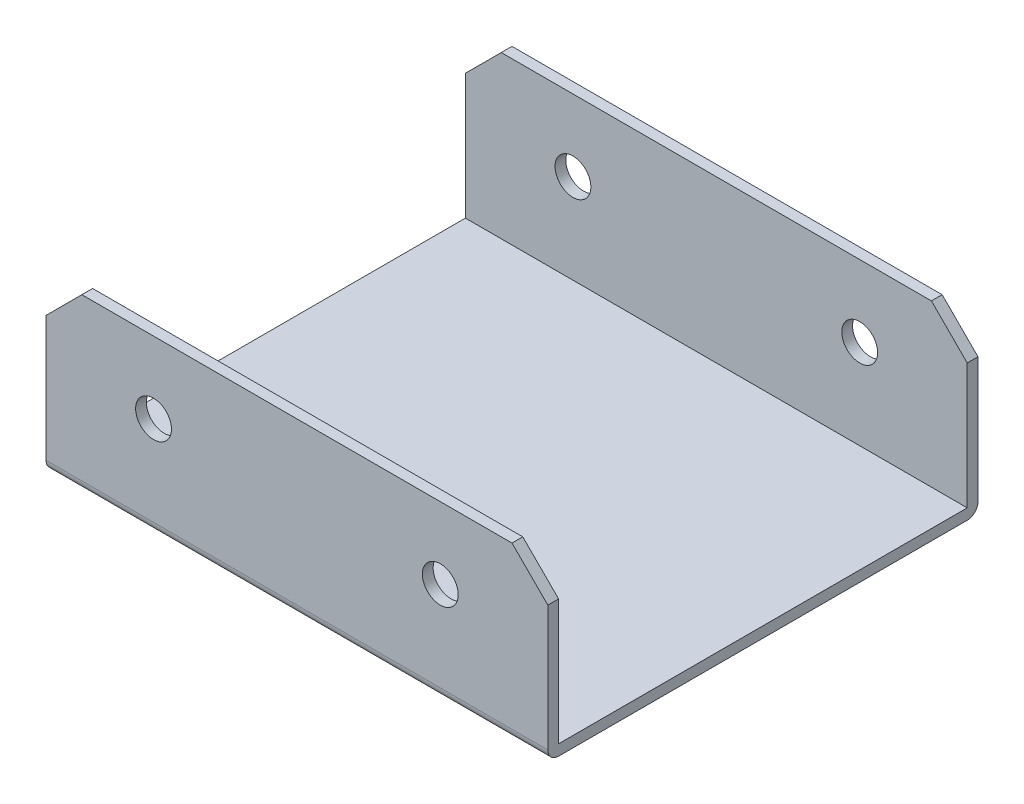
ISO-10303-21;
HEADER;
FILE_DESCRIPTION(('STEP AP214'),'2;1');
FILE_NAME('part.step','',(''),(''),'','','');
FILE_SCHEMA(('AUTOMOTIVE_DESIGN { 1 0 10303 214 1 1 1 1 }'));
ENDSEC;
DATA;
#1=APPLICATION_CONTEXT('core data for automotive mechanical design processes');
#2=APPLICATION_PROTOCOL_DEFINITION('international standard','automotive_design',2000,#1);
#3=PRODUCT_CONTEXT('',#1,'mechanical');
#4=PRODUCT('Part','Part','',(#3));
#5=PRODUCT_RELATED_PRODUCT_CATEGORY('part','',(#4));
#6=PRODUCT_DEFINITION_FORMATION('','',#4);
#7=PRODUCT_DEFINITION_CONTEXT('part definition',#1,'design');
#8=PRODUCT_DEFINITION('design','',#6,#7);
#9=PRODUCT_DEFINITION_SHAPE('','',#8);
#10=(LENGTH_UNIT() NAMED_UNIT(*) SI_UNIT(.MILLI.,.METRE.));
#11=(NAMED_UNIT(*) PLANE_ANGLE_UNIT() SI_UNIT($,.RADIAN.));
#12=(NAMED_UNIT(*) SI_UNIT($,.STERADIAN.) SOLID_ANGLE_UNIT());
#13=UNCERTAINTY_MEASURE_WITH_UNIT(LENGTH_MEASURE(1.E-05),#10,'distance_accuracy_value','');
#14=(GEOMETRIC_REPRESENTATION_CONTEXT(3) GLOBAL_UNCERTAINTY_ASSIGNED_CONTEXT((#13)) GLOBAL_UNIT_ASSIGNED_CONTEXT((#10,
#11,#12)) REPRESENTATION_CONTEXT('',''));
#15=CARTESIAN_POINT('',(0.,0.,0.));
#16=DIRECTION('',(0.,0.,1.));
#17=DIRECTION('',(1.,0.,0.));
#18=AXIS2_PLACEMENT_3D('',#15,#16,#17);
#19=CARTESIAN_POINT('',(-35.,24.,0.));
#20=DIRECTION('',(0.,1.,0.));
#21=DIRECTION('',(0.,0.,1.));
#22=AXIS2_PLACEMENT_3D('',#19,#20,#21);
#23=PLANE('',#22);
#24=DIRECTION('',(1.,0.,0.));
#25=VECTOR('',#24,1.);
#26=CARTESIAN_POINT('',(-35.,24.,30.));
#27=LINE('',#26,#25);
#28=CARTESIAN_POINT('',(-30.,24.,30.));
#29=VERTEX_POINT('',#28);
#30=CARTESIAN_POINT('',(30.,24.,30.));
#31=VERTEX_POINT('',#30);
#32=EDGE_CURVE('E163',#29,#31,#27,.T.);
#33=ORIENTED_EDGE('',*,*,#32,.T.);
#34=DIRECTION('',(0.,0.,-1.));
#35=VECTOR('',#34,1.);
#36=CARTESIAN_POINT('',(30.,24.,0.));
#37=LINE('',#36,#35);
#38=CARTESIAN_POINT('',(30.,24.,28.5));
#39=VERTEX_POINT('',#38);
#40=EDGE_CURVE('E233',#31,#39,#37,.T.);
#41=ORIENTED_EDGE('',*,*,#40,.T.);
#42=DIRECTION('',(1.,0.,0.));
#43=VECTOR('',#42,1.);
#44=CARTESIAN_POINT('',(-35.,24.,28.5));
#45=LINE('',#44,#43);
#46=CARTESIAN_POINT('',(-30.,24.,28.5));
#47=VERTEX_POINT('',#46);
#48=EDGE_CURVE('E203',#47,#39,#45,.T.);
#49=ORIENTED_EDGE('',*,*,#48,.F.);
#50=DIRECTION('',(0.,0.,1.));
#51=VECTOR('',#50,1.);
#52=CARTESIAN_POINT('',(-30.,24.,30.));
#53=LINE('',#52,#51);
#54=EDGE_CURVE('E230',#47,#29,#53,.T.);
#55=ORIENTED_EDGE('',*,*,#54,.T.);
#56=EDGE_LOOP('',(#33,#41,#49,#55));
#57=FACE_BOUND('',#56,.T.);
#58=ADVANCED_FACE('F37',(#57),#23,.T.);
#59=CARTESIAN_POINT('',(-35.,0.,28.5));
#60=DIRECTION('',(0.,0.,-1.));
#61=DIRECTION('',(0.,1.,0.));
#62=AXIS2_PLACEMENT_3D('',#59,#60,#61);
#63=PLANE('',#62);
#64=CARTESIAN_POINT('',(-20.,14.,28.5));
#65=DIRECTION('',(0.,0.,-1.));
#66=DIRECTION('',(0.,1.,0.));
#67=AXIS2_PLACEMENT_3D('',#64,#65,#66);
#68=CIRCLE('',#67,2.5);
#69=CARTESIAN_POINT('',(-17.5,14.,28.5));
#70=VERTEX_POINT('',#69);
#71=EDGE_CURVE('E152',#70,#70,#68,.T.);
#72=ORIENTED_EDGE('',*,*,#71,.F.);
#73=EDGE_LOOP('',(#72));
#74=FACE_BOUND('',#73,.T.);
#75=CARTESIAN_POINT('',(20.,14.,28.5));
#76=DIRECTION('',(0.,0.,-1.));
#77=DIRECTION('',(0.,1.,0.));
#78=AXIS2_PLACEMENT_3D('',#75,#76,#77);
#79=CIRCLE('',#78,2.5);
#80=CARTESIAN_POINT('',(22.5,14.,28.5));
#81=VERTEX_POINT('',#80);
#82=EDGE_CURVE('E360',#81,#81,#79,.T.);
#83=ORIENTED_EDGE('',*,*,#82,.F.);
#84=EDGE_LOOP('',(#83));
#85=FACE_BOUND('',#84,.T.);
#86=ORIENTED_EDGE('',*,*,#48,.T.);
#87=DIRECTION('',(-0.707106781186548,0.707106781186548,0.));
#88=VECTOR('',#87,1.);
#89=CARTESIAN_POINT('',(9.49999999999998,44.5,28.5));
#90=LINE('',#89,#88);
#91=CARTESIAN_POINT('',(35.,18.9999999999999,28.5));
#92=VERTEX_POINT('',#91);
#93=EDGE_CURVE('E237',#39,#92,#90,.F.);
#94=ORIENTED_EDGE('',*,*,#93,.T.);
#95=DIRECTION('',(0.,1.,0.));
#96=VECTOR('',#95,1.);
#97=CARTESIAN_POINT('',(35.,0.,28.5));
#98=LINE('',#97,#96);
#99=CARTESIAN_POINT('',(35.,1.4999999999997,28.5));
#100=VERTEX_POINT('',#99);
#101=EDGE_CURVE('E182',#100,#92,#98,.T.);
#102=ORIENTED_EDGE('',*,*,#101,.F.);
#103=DIRECTION('',(1.,0.,0.));
#104=VECTOR('',#103,1.);
#105=CARTESIAN_POINT('',(-35.,1.4999999999997,28.5));
#106=LINE('',#105,#104);
#107=CARTESIAN_POINT('',(-35.,1.4999999999997,28.5));
#108=VERTEX_POINT('',#107);
#109=EDGE_CURVE('E207',#108,#100,#106,.T.);
#110=ORIENTED_EDGE('',*,*,#109,.F.);
#111=DIRECTION('',(0.,1.,0.));
#112=VECTOR('',#111,1.);
#113=CARTESIAN_POINT('',(-35.,0.,28.5));
#114=LINE('',#113,#112);
#115=CARTESIAN_POINT('',(-35.,18.9999999999999,28.5));
#116=VERTEX_POINT('',#115);
#117=EDGE_CURVE('E200',#108,#116,#114,.T.);
#118=ORIENTED_EDGE('',*,*,#117,.T.);
#119=DIRECTION('',(0.707106781186548,0.707106781186548,0.));
#120=VECTOR('',#119,1.);
#121=CARTESIAN_POINT('',(-44.5,9.49999999999997,28.5));
#122=LINE('',#121,#120);
#123=EDGE_CURVE('E235',#116,#47,#122,.T.);
#124=ORIENTED_EDGE('',*,*,#123,.T.);
#125=EDGE_LOOP('',(#86,#94,#102,#110,#118,#124));
#126=FACE_BOUND('',#125,.T.);
#127=ADVANCED_FACE('F256',(#74,#85,#126),#63,.T.);
#128=CARTESIAN_POINT('',(-35.,1.49999999999971,0.));
#129=DIRECTION('',(0.,-1.,0.));
#130=DIRECTION('',(0.,0.,-1.));
#131=AXIS2_PLACEMENT_3D('',#128,#129,#130);
#132=PLANE('',#131);
#133=ORIENTED_EDGE('',*,*,#109,.T.);
#134=DIRECTION('',(0.,0.,-1.));
#135=VECTOR('',#134,1.);
#136=CARTESIAN_POINT('',(35.,1.49999999999971,0.));
#137=LINE('',#136,#135);
#138=CARTESIAN_POINT('',(35.,1.5,-28.5));
#139=VERTEX_POINT('',#138);
#140=EDGE_CURVE('E179',#100,#139,#137,.T.);
#141=ORIENTED_EDGE('',*,*,#140,.T.);
#142=DIRECTION('',(1.,0.,0.));
#143=VECTOR('',#142,1.);
#144=CARTESIAN_POINT('',(-35.,1.5,-28.5));
#145=LINE('',#144,#143);
#146=CARTESIAN_POINT('',(-35.,1.5,-28.5));
#147=VERTEX_POINT('',#146);
#148=EDGE_CURVE('E209',#147,#139,#145,.T.);
#149=ORIENTED_EDGE('',*,*,#148,.F.);
#150=DIRECTION('',(0.,0.,-1.));
#151=VECTOR('',#150,1.);
#152=CARTESIAN_POINT('',(-35.,1.49999999999971,0.));
#153=LINE('',#152,#151);
#154=EDGE_CURVE('E197',#108,#147,#153,.T.);
#155=ORIENTED_EDGE('',*,*,#154,.F.);
#156=EDGE_LOOP('',(#133,#141,#149,#155));
#157=FACE_BOUND('',#156,.T.);
#158=ADVANCED_FACE('F271',(#157),#132,.F.);
#159=CARTESIAN_POINT('',(-35.,0.,-28.5));
#160=DIRECTION('',(0.,0.,1.));
#161=DIRECTION('',(1.,0.,0.));
#162=AXIS2_PLACEMENT_3D('',#159,#160,#161);
#163=PLANE('',#162);
#164=CARTESIAN_POINT('',(-20.,14.,-28.5));
#165=DIRECTION('',(0.,0.,1.));
#166=DIRECTION('',(1.,0.,0.));
#167=AXIS2_PLACEMENT_3D('',#164,#165,#166);
#168=CIRCLE('',#167,2.5);
#169=CARTESIAN_POINT('',(-17.5,14.,-28.5));
#170=VERTEX_POINT('',#169);
#171=EDGE_CURVE('E362',#170,#170,#168,.T.);
#172=ORIENTED_EDGE('',*,*,#171,.F.);
#173=EDGE_LOOP('',(#172));
#174=FACE_BOUND('',#173,.T.);
#175=CARTESIAN_POINT('',(20.,14.,-28.5));
#176=DIRECTION('',(0.,0.,1.));
#177=DIRECTION('',(1.,0.,0.));
#178=AXIS2_PLACEMENT_3D('',#175,#176,#177);
#179=CIRCLE('',#178,2.5);
#180=CARTESIAN_POINT('',(22.5,14.,-28.5));
#181=VERTEX_POINT('',#180);
#182=EDGE_CURVE('E344',#181,#181,#179,.T.);
#183=ORIENTED_EDGE('',*,*,#182,.F.);
#184=EDGE_LOOP('',(#183));
#185=FACE_BOUND('',#184,.T.);
#186=DIRECTION('',(0.,-1.,0.));
#187=VECTOR('',#186,1.);
#188=CARTESIAN_POINT('',(35.,0.,-28.5));
#189=LINE('',#188,#187);
#190=CARTESIAN_POINT('',(35.,19.,-28.5));
#191=VERTEX_POINT('',#190);
#192=EDGE_CURVE('E177',#191,#139,#189,.T.);
#193=ORIENTED_EDGE('',*,*,#192,.F.);
#194=DIRECTION('',(0.707106781186548,-0.707106781186547,0.));
#195=VECTOR('',#194,1.);
#196=CARTESIAN_POINT('',(9.49999999999997,44.5,-28.5));
#197=LINE('',#196,#195);
#198=CARTESIAN_POINT('',(30.,24.,-28.5));
#199=VERTEX_POINT('',#198);
#200=EDGE_CURVE('E241',#191,#199,#197,.F.);
#201=ORIENTED_EDGE('',*,*,#200,.T.);
#202=DIRECTION('',(1.,0.,0.));
#203=VECTOR('',#202,1.);
#204=CARTESIAN_POINT('',(-35.,24.,-28.5));
#205=LINE('',#204,#203);
#206=CARTESIAN_POINT('',(-30.,24.,-28.5));
#207=VERTEX_POINT('',#206);
#208=EDGE_CURVE('E212',#207,#199,#205,.T.);
#209=ORIENTED_EDGE('',*,*,#208,.F.);
#210=DIRECTION('',(-0.707106781186548,-0.707106781186547,0.));
#211=VECTOR('',#210,1.);
#212=CARTESIAN_POINT('',(-44.5,9.5,-28.5));
#213=LINE('',#212,#211);
#214=CARTESIAN_POINT('',(-35.,19.,-28.5));
#215=VERTEX_POINT('',#214);
#216=EDGE_CURVE('E239',#207,#215,#213,.T.);
#217=ORIENTED_EDGE('',*,*,#216,.T.);
#218=DIRECTION('',(0.,-1.,0.));
#219=VECTOR('',#218,1.);
#220=CARTESIAN_POINT('',(-35.,0.,-28.5));
#221=LINE('',#220,#219);
#222=EDGE_CURVE('E195',#215,#147,#221,.T.);
#223=ORIENTED_EDGE('',*,*,#222,.T.);
#224=ORIENTED_EDGE('',*,*,#148,.T.);
#225=EDGE_LOOP('',(#193,#201,#209,#217,#223,#224));
#226=FACE_BOUND('',#225,.T.);
#227=ADVANCED_FACE('F282',(#174,#185,#226),#163,.T.);
#228=CARTESIAN_POINT('',(-35.,24.0000000000001,0.));
#229=DIRECTION('',(0.,1.,0.));
#230=DIRECTION('',(0.,0.,1.));
#231=AXIS2_PLACEMENT_3D('',#228,#229,#230);
#232=PLANE('',#231);
#233=ORIENTED_EDGE('',*,*,#208,.T.);
#234=DIRECTION('',(0.,0.,-1.));
#235=VECTOR('',#234,1.);
#236=CARTESIAN_POINT('',(30.,24.0000000000001,0.));
#237=LINE('',#236,#235);
#238=CARTESIAN_POINT('',(30.,24.,-30.));
#239=VERTEX_POINT('',#238);
#240=EDGE_CURVE('E58',#199,#239,#237,.T.);
#241=ORIENTED_EDGE('',*,*,#240,.T.);
#242=DIRECTION('',(1.,0.,0.));
#243=VECTOR('',#242,1.);
#244=CARTESIAN_POINT('',(-35.,24.,-30.));
#245=LINE('',#244,#243);
#246=CARTESIAN_POINT('',(-30.,24.,-30.));
#247=VERTEX_POINT('',#246);
#248=EDGE_CURVE('E214',#247,#239,#245,.T.);
#249=ORIENTED_EDGE('',*,*,#248,.F.);
#250=DIRECTION('',(0.,0.,1.));
#251=VECTOR('',#250,1.);
#252=CARTESIAN_POINT('',(-30.,24.,-28.5));
#253=LINE('',#252,#251);
#254=EDGE_CURVE('E243',#247,#207,#253,.T.);
#255=ORIENTED_EDGE('',*,*,#254,.T.);
#256=EDGE_LOOP('',(#233,#241,#249,#255));
#257=FACE_BOUND('',#256,.T.);
#258=ADVANCED_FACE('F280',(#257),#232,.T.);
#259=CARTESIAN_POINT('',(-35.,0.,-30.));
#260=DIRECTION('',(0.,0.,-1.));
#261=DIRECTION('',(0.,1.,0.));
#262=AXIS2_PLACEMENT_3D('',#259,#260,#261);
#263=PLANE('',#262);
#264=CARTESIAN_POINT('',(-20.,14.,-30.));
#265=DIRECTION('',(0.,0.,1.));
#266=DIRECTION('',(1.,0.,0.));
#267=AXIS2_PLACEMENT_3D('',#264,#265,#266);
#268=CIRCLE('',#267,2.5);
#269=CARTESIAN_POINT('',(-17.5,14.,-30.));
#270=VERTEX_POINT('',#269);
#271=EDGE_CURVE('E353',#270,#270,#268,.T.);
#272=ORIENTED_EDGE('',*,*,#271,.T.);
#273=EDGE_LOOP('',(#272));
#274=FACE_BOUND('',#273,.T.);
#275=CARTESIAN_POINT('',(20.,14.,-30.));
#276=DIRECTION('',(0.,0.,1.));
#277=DIRECTION('',(1.,0.,0.));
#278=AXIS2_PLACEMENT_3D('',#275,#276,#277);
#279=CIRCLE('',#278,2.5);
#280=CARTESIAN_POINT('',(22.5,14.,-30.));
#281=VERTEX_POINT('',#280);
#282=EDGE_CURVE('E347',#281,#281,#279,.T.);
#283=ORIENTED_EDGE('',*,*,#282,.T.);
#284=EDGE_LOOP('',(#283));
#285=FACE_BOUND('',#284,.T.);
#286=ORIENTED_EDGE('',*,*,#248,.T.);
#287=DIRECTION('',(-0.707106781186548,0.707106781186547,0.));
#288=VECTOR('',#287,1.);
#289=CARTESIAN_POINT('',(9.49999999999997,44.5,-30.));
#290=LINE('',#289,#288);
#291=CARTESIAN_POINT('',(35.,19.,-30.));
#292=VERTEX_POINT('',#291);
#293=EDGE_CURVE('E249',#239,#292,#290,.F.);
#294=ORIENTED_EDGE('',*,*,#293,.T.);
#295=DIRECTION('',(0.,1.,0.));
#296=VECTOR('',#295,1.);
#297=CARTESIAN_POINT('',(35.,0.,-30.));
#298=LINE('',#297,#296);
#299=CARTESIAN_POINT('',(35.,1.50000000000001,-30.));
#300=VERTEX_POINT('',#299);
#301=EDGE_CURVE('E174',#300,#292,#298,.T.);
#302=ORIENTED_EDGE('',*,*,#301,.F.);
#303=DIRECTION('',(1.,0.,0.));
#304=VECTOR('',#303,1.);
#305=CARTESIAN_POINT('',(-35.,1.50000000000001,-30.));
#306=LINE('',#305,#304);
#307=CARTESIAN_POINT('',(-35.,1.50000000000001,-30.));
#308=VERTEX_POINT('',#307);
#309=EDGE_CURVE('E216',#308,#300,#306,.T.);
#310=ORIENTED_EDGE('',*,*,#309,.F.);
#311=DIRECTION('',(0.,1.,0.));
#312=VECTOR('',#311,1.);
#313=CARTESIAN_POINT('',(-35.,0.,-30.));
#314=LINE('',#313,#312);
#315=CARTESIAN_POINT('',(-35.,19.,-30.));
#316=VERTEX_POINT('',#315);
#317=EDGE_CURVE('E193',#308,#316,#314,.T.);
#318=ORIENTED_EDGE('',*,*,#317,.T.);
#319=DIRECTION('',(0.707106781186548,0.707106781186547,0.));
#320=VECTOR('',#319,1.);
#321=CARTESIAN_POINT('',(-44.5,9.49999999999999,-30.));
#322=LINE('',#321,#320);
#323=EDGE_CURVE('E247',#316,#247,#322,.T.);
#324=ORIENTED_EDGE('',*,*,#323,.T.);
#325=EDGE_LOOP('',(#286,#294,#302,#310,#318,#324));
#326=FACE_BOUND('',#325,.T.);
#327=ADVANCED_FACE('F278',(#274,#285,#326),#263,.T.);
#328=CARTESIAN_POINT('',(-35.,1.5,-28.5));
#329=DIRECTION('',(1.,0.,0.));
#330=DIRECTION('',(0.,0.,-1.));
#331=AXIS2_PLACEMENT_3D('',#328,#329,#330);
#332=CYLINDRICAL_SURFACE('',#331,1.49999999999999);
#333=ORIENTED_EDGE('',*,*,#309,.T.);
#334=CARTESIAN_POINT('',(35.,1.5,-28.5));
#335=DIRECTION('',(1.,0.,0.));
#336=DIRECTION('',(0.,0.,-1.));
#337=AXIS2_PLACEMENT_3D('',#334,#335,#336);
#338=CIRCLE('',#337,1.49999999999999);
#339=CARTESIAN_POINT('',(35.,0.,-28.5));
#340=VERTEX_POINT('',#339);
#341=EDGE_CURVE('E168',#340,#300,#338,.T.);
#342=ORIENTED_EDGE('',*,*,#341,.F.);
#343=DIRECTION('',(1.,0.,0.));
#344=VECTOR('',#343,1.);
#345=CARTESIAN_POINT('',(-35.,0.,-28.5));
#346=LINE('',#345,#344);
#347=CARTESIAN_POINT('',(-35.,0.,-28.5));
#348=VERTEX_POINT('',#347);
#349=EDGE_CURVE('E218',#348,#340,#346,.T.);
#350=ORIENTED_EDGE('',*,*,#349,.F.);
#351=CARTESIAN_POINT('',(-35.,1.5,-28.5));
#352=DIRECTION('',(1.,0.,0.));
#353=DIRECTION('',(0.,0.,-1.));
#354=AXIS2_PLACEMENT_3D('',#351,#352,#353);
#355=CIRCLE('',#354,1.49999999999999);
#356=EDGE_CURVE('E190',#348,#308,#355,.T.);
#357=ORIENTED_EDGE('',*,*,#356,.T.);
#358=EDGE_LOOP('',(#333,#342,#350,#357));
#359=FACE_BOUND('',#358,.T.);
#360=ADVANCED_FACE('F291',(#359),#332,.T.);
#361=CARTESIAN_POINT('',(-35.,0.,0.));
#362=DIRECTION('',(0.,-1.,0.));
#363=DIRECTION('',(0.,0.,-1.));
#364=AXIS2_PLACEMENT_3D('',#361,#362,#363);
#365=PLANE('',#364);
#366=ORIENTED_EDGE('',*,*,#349,.T.);
#367=DIRECTION('',(0.,0.,-1.));
#368=VECTOR('',#367,1.);
#369=CARTESIAN_POINT('',(35.,0.,0.));
#370=LINE('',#369,#368);
#371=CARTESIAN_POINT('',(35.,0.,28.5));
#372=VERTEX_POINT('',#371);
#373=EDGE_CURVE('E166',#372,#340,#370,.T.);
#374=ORIENTED_EDGE('',*,*,#373,.F.);
#375=DIRECTION('',(1.,0.,0.));
#376=VECTOR('',#375,1.);
#377=CARTESIAN_POINT('',(-35.,0.,28.5));
#378=LINE('',#377,#376);
#379=CARTESIAN_POINT('',(-35.,0.,28.5));
#380=VERTEX_POINT('',#379);
#381=EDGE_CURVE('E162',#380,#372,#378,.T.);
#382=ORIENTED_EDGE('',*,*,#381,.F.);
#383=DIRECTION('',(0.,0.,-1.));
#384=VECTOR('',#383,1.);
#385=CARTESIAN_POINT('',(-35.,0.,0.));
#386=LINE('',#385,#384);
#387=EDGE_CURVE('E187',#380,#348,#386,.T.);
#388=ORIENTED_EDGE('',*,*,#387,.T.);
#389=EDGE_LOOP('',(#366,#374,#382,#388));
#390=FACE_BOUND('',#389,.T.);
#391=ADVANCED_FACE('F293',(#390),#365,.T.);
#392=CARTESIAN_POINT('',(-35.,1.49999999999997,28.5));
#393=DIRECTION('',(1.,0.,0.));
#394=DIRECTION('',(0.,0.,-1.));
#395=AXIS2_PLACEMENT_3D('',#392,#393,#394);
#396=CYLINDRICAL_SURFACE('',#395,1.49999999999999);
#397=ORIENTED_EDGE('',*,*,#381,.T.);
#398=CARTESIAN_POINT('',(35.,1.49999999999997,28.5));
#399=DIRECTION('',(1.,0.,0.));
#400=DIRECTION('',(0.,0.,-1.));
#401=AXIS2_PLACEMENT_3D('',#398,#399,#400);
#402=CIRCLE('',#401,1.49999999999999);
#403=CARTESIAN_POINT('',(35.,1.49999999999998,30.));
#404=VERTEX_POINT('',#403);
#405=EDGE_CURVE('E147',#404,#372,#402,.T.);
#406=ORIENTED_EDGE('',*,*,#405,.F.);
#407=DIRECTION('',(1.,0.,0.));
#408=VECTOR('',#407,1.);
#409=CARTESIAN_POINT('',(-35.,1.49999999999998,30.));
#410=LINE('',#409,#408);
#411=CARTESIAN_POINT('',(-35.,1.49999999999998,30.));
#412=VERTEX_POINT('',#411);
#413=EDGE_CURVE('E155',#412,#404,#410,.T.);
#414=ORIENTED_EDGE('',*,*,#413,.F.);
#415=CARTESIAN_POINT('',(-35.,1.49999999999997,28.5));
#416=DIRECTION('',(1.,0.,0.));
#417=DIRECTION('',(0.,0.,-1.));
#418=AXIS2_PLACEMENT_3D('',#415,#416,#417);
#419=CIRCLE('',#418,1.49999999999999);
#420=EDGE_CURVE('E185',#412,#380,#419,.T.);
#421=ORIENTED_EDGE('',*,*,#420,.T.);
#422=EDGE_LOOP('',(#397,#406,#414,#421));
#423=FACE_BOUND('',#422,.T.);
#424=ADVANCED_FACE('F165',(#423),#396,.T.);
#425=CARTESIAN_POINT('',(-35.,0.,30.));
#426=DIRECTION('',(0.,0.,1.));
#427=DIRECTION('',(1.,0.,0.));
#428=AXIS2_PLACEMENT_3D('',#425,#426,#427);
#429=PLANE('',#428);
#430=CARTESIAN_POINT('',(-20.,14.,30.));
#431=DIRECTION('',(0.,0.,1.));
#432=DIRECTION('',(1.,0.,0.));
#433=AXIS2_PLACEMENT_3D('',#430,#431,#432);
#434=CIRCLE('',#433,2.5);
#435=CARTESIAN_POINT('',(-17.5,14.,30.));
#436=VERTEX_POINT('',#435);
#437=EDGE_CURVE('E349',#436,#436,#434,.T.);
#438=ORIENTED_EDGE('',*,*,#437,.F.);
#439=EDGE_LOOP('',(#438));
#440=FACE_BOUND('',#439,.T.);
#441=CARTESIAN_POINT('',(20.,14.,30.));
#442=DIRECTION('',(0.,0.,1.));
#443=DIRECTION('',(1.,0.,0.));
#444=AXIS2_PLACEMENT_3D('',#441,#442,#443);
#445=CIRCLE('',#444,2.5);
#446=CARTESIAN_POINT('',(22.5,14.,30.));
#447=VERTEX_POINT('',#446);
#448=EDGE_CURVE('E350',#447,#447,#445,.T.);
#449=ORIENTED_EDGE('',*,*,#448,.F.);
#450=EDGE_LOOP('',(#449));
#451=FACE_BOUND('',#450,.T.);
#452=DIRECTION('',(0.,-1.,0.));
#453=VECTOR('',#452,1.);
#454=CARTESIAN_POINT('',(35.,0.,30.));
#455=LINE('',#454,#453);
#456=CARTESIAN_POINT('',(35.,18.9999999999999,30.));
#457=VERTEX_POINT('',#456);
#458=EDGE_CURVE('E141',#457,#404,#455,.T.);
#459=ORIENTED_EDGE('',*,*,#458,.F.);
#460=DIRECTION('',(0.707106781186548,-0.707106781186548,0.));
#461=VECTOR('',#460,1.);
#462=CARTESIAN_POINT('',(9.49999999999997,44.5,30.));
#463=LINE('',#462,#461);
#464=EDGE_CURVE('E228',#457,#31,#463,.F.);
#465=ORIENTED_EDGE('',*,*,#464,.T.);
#466=ORIENTED_EDGE('',*,*,#32,.F.);
#467=DIRECTION('',(-0.707106781186548,-0.707106781186548,0.));
#468=VECTOR('',#467,1.);
#469=CARTESIAN_POINT('',(-44.5,9.49999999999997,30.));
#470=LINE('',#469,#468);
#471=CARTESIAN_POINT('',(-35.,18.9999999999999,30.));
#472=VERTEX_POINT('',#471);
#473=EDGE_CURVE('E226',#29,#472,#470,.T.);
#474=ORIENTED_EDGE('',*,*,#473,.T.);
#475=DIRECTION('',(0.,-1.,0.));
#476=VECTOR('',#475,1.);
#477=CARTESIAN_POINT('',(-35.,0.,30.));
#478=LINE('',#477,#476);
#479=EDGE_CURVE('E158',#472,#412,#478,.T.);
#480=ORIENTED_EDGE('',*,*,#479,.T.);
#481=ORIENTED_EDGE('',*,*,#413,.T.);
#482=EDGE_LOOP('',(#459,#465,#466,#474,#480,#481));
#483=FACE_BOUND('',#482,.T.);
#484=ADVANCED_FACE('F156',(#440,#451,#483),#429,.T.);
#485=CARTESIAN_POINT('',(-35.,0.,0.));
#486=DIRECTION('',(1.,0.,0.));
#487=DIRECTION('',(0.,0.,-1.));
#488=AXIS2_PLACEMENT_3D('',#485,#486,#487);
#489=PLANE('',#488);
#490=ORIENTED_EDGE('',*,*,#222,.F.);
#491=DIRECTION('',(0.,0.,-1.));
#492=VECTOR('',#491,1.);
#493=CARTESIAN_POINT('',(-35.,19.,-30.));
#494=LINE('',#493,#492);
#495=EDGE_CURVE('E11',#215,#316,#494,.T.);
#496=ORIENTED_EDGE('',*,*,#495,.T.);
#497=ORIENTED_EDGE('',*,*,#317,.F.);
#498=ORIENTED_EDGE('',*,*,#356,.F.);
#499=ORIENTED_EDGE('',*,*,#387,.F.);
#500=ORIENTED_EDGE('',*,*,#420,.F.);
#501=ORIENTED_EDGE('',*,*,#479,.F.);
#502=DIRECTION('',(0.,0.,-1.));
#503=VECTOR('',#502,1.);
#504=CARTESIAN_POINT('',(-35.,18.9999999999999,28.5));
#505=LINE('',#504,#503);
#506=EDGE_CURVE('E45',#472,#116,#505,.T.);
#507=ORIENTED_EDGE('',*,*,#506,.T.);
#508=ORIENTED_EDGE('',*,*,#117,.F.);
#509=ORIENTED_EDGE('',*,*,#154,.T.);
#510=EDGE_LOOP('',(#490,#496,#497,#498,#499,#500,#501,#507,#508,#509));
#511=FACE_BOUND('',#510,.T.);
#512=ADVANCED_FACE('F252',(#511),#489,.F.);
#513=CARTESIAN_POINT('',(35.,0.,0.));
#514=DIRECTION('',(1.,0.,0.));
#515=DIRECTION('',(0.,0.,-1.));
#516=AXIS2_PLACEMENT_3D('',#513,#514,#515);
#517=PLANE('',#516);
#518=ORIENTED_EDGE('',*,*,#101,.T.);
#519=DIRECTION('',(0.,0.,1.));
#520=VECTOR('',#519,1.);
#521=CARTESIAN_POINT('',(35.,18.9999999999999,0.));
#522=LINE('',#521,#520);
#523=EDGE_CURVE('E150',#92,#457,#522,.T.);
#524=ORIENTED_EDGE('',*,*,#523,.T.);
#525=ORIENTED_EDGE('',*,*,#458,.T.);
#526=ORIENTED_EDGE('',*,*,#405,.T.);
#527=ORIENTED_EDGE('',*,*,#373,.T.);
#528=ORIENTED_EDGE('',*,*,#341,.T.);
#529=ORIENTED_EDGE('',*,*,#301,.T.);
#530=DIRECTION('',(0.,0.,1.));
#531=VECTOR('',#530,1.);
#532=CARTESIAN_POINT('',(35.,19.,0.));
#533=LINE('',#532,#531);
#534=EDGE_CURVE('E206',#292,#191,#533,.T.);
#535=ORIENTED_EDGE('',*,*,#534,.T.);
#536=ORIENTED_EDGE('',*,*,#192,.T.);
#537=ORIENTED_EDGE('',*,*,#140,.F.);
#538=EDGE_LOOP('',(#518,#524,#525,#526,#527,#528,#529,#535,#536,#537));
#539=FACE_BOUND('',#538,.T.);
#540=ADVANCED_FACE('F144',(#539),#517,.T.);
#541=CARTESIAN_POINT('',(35.,18.9999999999999,0.));
#542=DIRECTION('',(-0.707106781186547,-0.707106781186547,0.));
#543=DIRECTION('',(0.,0.,1.));
#544=AXIS2_PLACEMENT_3D('',#541,#542,#543);
#545=PLANE('',#544);
#546=ORIENTED_EDGE('',*,*,#93,.F.);
#547=ORIENTED_EDGE('',*,*,#40,.F.);
#548=ORIENTED_EDGE('',*,*,#464,.F.);
#549=ORIENTED_EDGE('',*,*,#523,.F.);
#550=EDGE_LOOP('',(#546,#547,#548,#549));
#551=FACE_BOUND('',#550,.T.);
#552=ADVANCED_FACE('F266',(#551),#545,.F.);
#553=CARTESIAN_POINT('',(35.,19.,0.));
#554=DIRECTION('',(-0.707106781186547,-0.707106781186548,0.));
#555=DIRECTION('',(0.,0.,1.));
#556=AXIS2_PLACEMENT_3D('',#553,#554,#555);
#557=PLANE('',#556);
#558=ORIENTED_EDGE('',*,*,#293,.F.);
#559=ORIENTED_EDGE('',*,*,#240,.F.);
#560=ORIENTED_EDGE('',*,*,#200,.F.);
#561=ORIENTED_EDGE('',*,*,#534,.F.);
#562=EDGE_LOOP('',(#558,#559,#560,#561));
#563=FACE_BOUND('',#562,.T.);
#564=ADVANCED_FACE('F285',(#563),#557,.F.);
#565=CARTESIAN_POINT('',(-30.,24.0000000000001,0.));
#566=DIRECTION('',(-0.707106781186547,0.707106781186548,0.));
#567=DIRECTION('',(0.,0.,-1.));
#568=AXIS2_PLACEMENT_3D('',#565,#566,#567);
#569=PLANE('',#568);
#570=ORIENTED_EDGE('',*,*,#323,.F.);
#571=ORIENTED_EDGE('',*,*,#495,.F.);
#572=ORIENTED_EDGE('',*,*,#216,.F.);
#573=ORIENTED_EDGE('',*,*,#254,.F.);
#574=EDGE_LOOP('',(#570,#571,#572,#573));
#575=FACE_BOUND('',#574,.T.);
#576=ADVANCED_FACE('F275',(#575),#569,.T.);
#577=CARTESIAN_POINT('',(-30.,24.,0.));
#578=DIRECTION('',(-0.707106781186547,0.707106781186547,0.));
#579=DIRECTION('',(0.,0.,-1.));
#580=AXIS2_PLACEMENT_3D('',#577,#578,#579);
#581=PLANE('',#580);
#582=ORIENTED_EDGE('',*,*,#123,.F.);
#583=ORIENTED_EDGE('',*,*,#506,.F.);
#584=ORIENTED_EDGE('',*,*,#473,.F.);
#585=ORIENTED_EDGE('',*,*,#54,.F.);
#586=EDGE_LOOP('',(#582,#583,#584,#585));
#587=FACE_BOUND('',#586,.T.);
#588=ADVANCED_FACE('F39',(#587),#581,.T.);
#589=CARTESIAN_POINT('',(20.,14.,-30.));
#590=DIRECTION('',(0.,0.,1.));
#591=DIRECTION('',(1.,0.,0.));
#592=AXIS2_PLACEMENT_3D('',#589,#590,#591);
#593=CYLINDRICAL_SURFACE('',#592,2.5);
#594=CARTESIAN_POINT('',(22.5,14.,28.5));
#595=CARTESIAN_POINT('',(22.5,14.,28.515625));
#596=CARTESIAN_POINT('',(22.5,14.,28.53125));
#597=CARTESIAN_POINT('',(22.5,14.,28.5625));
#598=CARTESIAN_POINT('',(22.5,14.,28.578125));
#599=CARTESIAN_POINT('',(22.5,14.,28.609375));
#600=CARTESIAN_POINT('',(22.5,14.,28.625));
#601=CARTESIAN_POINT('',(22.5,14.,28.65625));
#602=CARTESIAN_POINT('',(22.5,14.,28.671875));
#603=CARTESIAN_POINT('',(22.5,14.,28.703125));
#604=CARTESIAN_POINT('',(22.5,14.,28.71875));
#605=CARTESIAN_POINT('',(22.5,14.,28.75));
#606=CARTESIAN_POINT('',(22.5,14.,28.765625));
#607=CARTESIAN_POINT('',(22.5,14.,28.796875));
#608=CARTESIAN_POINT('',(22.5,14.,28.8125));
#609=CARTESIAN_POINT('',(22.5,14.,28.84375));
#610=CARTESIAN_POINT('',(22.5,14.,28.859375));
#611=CARTESIAN_POINT('',(22.5,14.,28.890625));
#612=CARTESIAN_POINT('',(22.5,14.,28.90625));
#613=CARTESIAN_POINT('',(22.5,14.,28.9375));
#614=CARTESIAN_POINT('',(22.5,14.,28.953125));
#615=CARTESIAN_POINT('',(22.5,14.,28.984375));
#616=CARTESIAN_POINT('',(22.5,14.,29.));
#617=CARTESIAN_POINT('',(22.5,14.,29.03125));
#618=CARTESIAN_POINT('',(22.5,14.,29.046875));
#619=CARTESIAN_POINT('',(22.5,14.,29.078125));
#620=CARTESIAN_POINT('',(22.5,14.,29.09375));
#621=CARTESIAN_POINT('',(22.5,14.,29.125));
#622=CARTESIAN_POINT('',(22.5,14.,29.140625));
#623=CARTESIAN_POINT('',(22.5,14.,29.171875));
#624=CARTESIAN_POINT('',(22.5,14.,29.1875));
#625=CARTESIAN_POINT('',(22.5,14.,29.21875));
#626=CARTESIAN_POINT('',(22.5,14.,29.234375));
#627=CARTESIAN_POINT('',(22.5,14.,29.265625));
#628=CARTESIAN_POINT('',(22.5,14.,29.28125));
#629=CARTESIAN_POINT('',(22.5,14.,29.3125));
#630=CARTESIAN_POINT('',(22.5,14.,29.328125));
#631=CARTESIAN_POINT('',(22.5,14.,29.359375));
#632=CARTESIAN_POINT('',(22.5,14.,29.375));
#633=CARTESIAN_POINT('',(22.5,14.,29.40625));
#634=CARTESIAN_POINT('',(22.5,14.,29.421875));
#635=CARTESIAN_POINT('',(22.5,14.,29.453125));
#636=CARTESIAN_POINT('',(22.5,14.,29.46875));
#637=CARTESIAN_POINT('',(22.5,14.,29.5));
#638=CARTESIAN_POINT('',(22.5,14.,29.515625));
#639=CARTESIAN_POINT('',(22.5,14.,29.546875));
#640=CARTESIAN_POINT('',(22.5,14.,29.5625));
#641=CARTESIAN_POINT('',(22.5,14.,29.59375));
#642=CARTESIAN_POINT('',(22.5,14.,29.609375));
#643=CARTESIAN_POINT('',(22.5,14.,29.640625));
#644=CARTESIAN_POINT('',(22.5,14.,29.65625));
#645=CARTESIAN_POINT('',(22.5,14.,29.6875));
#646=CARTESIAN_POINT('',(22.5,14.,29.703125));
#647=CARTESIAN_POINT('',(22.5,14.,29.734375));
#648=CARTESIAN_POINT('',(22.5,14.,29.75));
#649=CARTESIAN_POINT('',(22.5,14.,29.78125));
#650=CARTESIAN_POINT('',(22.5,14.,29.796875));
#651=CARTESIAN_POINT('',(22.5,14.,29.828125));
#652=CARTESIAN_POINT('',(22.5,14.,29.84375));
#653=CARTESIAN_POINT('',(22.5,14.,29.875));
#654=CARTESIAN_POINT('',(22.5,14.,29.890625));
#655=CARTESIAN_POINT('',(22.5,14.,29.921875));
#656=CARTESIAN_POINT('',(22.5,14.,29.9375));
#657=CARTESIAN_POINT('',(22.5,14.,29.96875));
#658=CARTESIAN_POINT('',(22.5,14.,29.984375));
#659=CARTESIAN_POINT('',(22.5,14.,30.));
#660=B_SPLINE_CURVE_WITH_KNOTS('',3,(#594,#595,#596,#597,#598,#599,#600,#601,#602,#603,#604,
#605,#606,#607,#608,#609,#610,#611,#612,#613,#614,#615,#616,#617,#618,#619,#620,#621,#622,#623,
#624,#625,#626,#627,#628,#629,#630,#631,#632,#633,#634,#635,#636,#637,#638,#639,#640,#641,#642,
#643,#644,#645,#646,#647,#648,#649,#650,#651,#652,#653,#654,#655,#656,#657,#658,#659),
.UNSPECIFIED.,.F.,.F.,(4,2,2,2,2,2,2,2,2,2,2,2,2,2,2,2,2,2,2,2,2,2,2,2,2,2,2,2,2,2,2,2,4),(0.,
0.0468750000000018,0.0937499999999966,0.140624999999998,0.1875,0.234374999999995,
0.281249999999997,0.328124999999999,0.375,0.421874999999995,0.468749999999997,0.515624999999999,
0.562499999999994,0.609374999999995,0.656249999999997,0.703124999999992,0.749999999999994,
0.796874999999996,0.84374999999999,0.890624999999992,0.937499999999994,0.984374999999989,
1.03124999999999,1.07812499999999,1.12499999999999,1.17187499999999,1.21874999999999,
1.26562499999999,1.31249999999999,1.35937499999999,1.40624999999999,1.45312499999999,
1.49999999999999),.UNSPECIFIED.);
#661=EDGE_CURVE('BSEAM318',#81,#447,#660,.T.);
#662=ORIENTED_EDGE('',*,*,#82,.T.);
#663=ORIENTED_EDGE('',*,*,#448,.T.);
#664=ORIENTED_EDGE('',*,*,#661,.T.);
#665=ORIENTED_EDGE('',*,*,#661,.F.);
#666=EDGE_LOOP('',(#662,#664,#663,#665));
#667=FACE_BOUND('',#666,.T.);
#668=ADVANCED_FACE('F318',(#667),#593,.F.);
#669=CARTESIAN_POINT('',(-20.,14.,-30.));
#670=DIRECTION('',(0.,0.,1.));
#671=DIRECTION('',(1.,0.,0.));
#672=AXIS2_PLACEMENT_3D('',#669,#670,#671);
#673=CYLINDRICAL_SURFACE('',#672,2.5);
#674=CARTESIAN_POINT('',(-17.5,14.,28.5));
#675=CARTESIAN_POINT('',(-17.5,14.,28.515625));
#676=CARTESIAN_POINT('',(-17.5,14.,28.53125));
#677=CARTESIAN_POINT('',(-17.5,14.,28.5625));
#678=CARTESIAN_POINT('',(-17.5,14.,28.578125));
#679=CARTESIAN_POINT('',(-17.5,14.,28.609375));
#680=CARTESIAN_POINT('',(-17.5,14.,28.625));
#681=CARTESIAN_POINT('',(-17.5,14.,28.65625));
#682=CARTESIAN_POINT('',(-17.5,14.,28.671875));
#683=CARTESIAN_POINT('',(-17.5,14.,28.703125));
#684=CARTESIAN_POINT('',(-17.5,14.,28.71875));
#685=CARTESIAN_POINT('',(-17.5,14.,28.75));
#686=CARTESIAN_POINT('',(-17.5,14.,28.765625));
#687=CARTESIAN_POINT('',(-17.5,14.,28.796875));
#688=CARTESIAN_POINT('',(-17.5,14.,28.8125));
#689=CARTESIAN_POINT('',(-17.5,14.,28.84375));
#690=CARTESIAN_POINT('',(-17.5,14.,28.859375));
#691=CARTESIAN_POINT('',(-17.5,14.,28.890625));
#692=CARTESIAN_POINT('',(-17.5,14.,28.90625));
#693=CARTESIAN_POINT('',(-17.5,14.,28.9375));
#694=CARTESIAN_POINT('',(-17.5,14.,28.953125));
#695=CARTESIAN_POINT('',(-17.5,14.,28.984375));
#696=CARTESIAN_POINT('',(-17.5,14.,29.));
#697=CARTESIAN_POINT('',(-17.5,14.,29.03125));
#698=CARTESIAN_POINT('',(-17.5,14.,29.046875));
#699=CARTESIAN_POINT('',(-17.5,14.,29.078125));
#700=CARTESIAN_POINT('',(-17.5,14.,29.09375));
#701=CARTESIAN_POINT('',(-17.5,14.,29.125));
#702=CARTESIAN_POINT('',(-17.5,14.,29.140625));
#703=CARTESIAN_POINT('',(-17.5,14.,29.171875));
#704=CARTESIAN_POINT('',(-17.5,14.,29.1875));
#705=CARTESIAN_POINT('',(-17.5,14.,29.21875));
#706=CARTESIAN_POINT('',(-17.5,14.,29.234375));
#707=CARTESIAN_POINT('',(-17.5,14.,29.265625));
#708=CARTESIAN_POINT('',(-17.5,14.,29.28125));
#709=CARTESIAN_POINT('',(-17.5,14.,29.3125));
#710=CARTESIAN_POINT('',(-17.5,14.,29.328125));
#711=CARTESIAN_POINT('',(-17.5,14.,29.359375));
#712=CARTESIAN_POINT('',(-17.5,14.,29.375));
#713=CARTESIAN_POINT('',(-17.5,14.,29.40625));
#714=CARTESIAN_POINT('',(-17.5,14.,29.421875));
#715=CARTESIAN_POINT('',(-17.5,14.,29.453125));
#716=CARTESIAN_POINT('',(-17.5,14.,29.46875));
#717=CARTESIAN_POINT('',(-17.5,14.,29.5));
#718=CARTESIAN_POINT('',(-17.5,14.,29.515625));
#719=CARTESIAN_POINT('',(-17.5,14.,29.546875));
#720=CARTESIAN_POINT('',(-17.5,14.,29.5625));
#721=CARTESIAN_POINT('',(-17.5,14.,29.59375));
#722=CARTESIAN_POINT('',(-17.5,14.,29.609375));
#723=CARTESIAN_POINT('',(-17.5,14.,29.640625));
#724=CARTESIAN_POINT('',(-17.5,14.,29.65625));
#725=CARTESIAN_POINT('',(-17.5,14.,29.6875));
#726=CARTESIAN_POINT('',(-17.5,14.,29.703125));
#727=CARTESIAN_POINT('',(-17.5,14.,29.734375));
#728=CARTESIAN_POINT('',(-17.5,14.,29.75));
#729=CARTESIAN_POINT('',(-17.5,14.,29.78125));
#730=CARTESIAN_POINT('',(-17.5,14.,29.796875));
#731=CARTESIAN_POINT('',(-17.5,14.,29.828125));
#732=CARTESIAN_POINT('',(-17.5,14.,29.84375));
#733=CARTESIAN_POINT('',(-17.5,14.,29.875));
#734=CARTESIAN_POINT('',(-17.5,14.,29.890625));
#735=CARTESIAN_POINT('',(-17.5,14.,29.921875));
#736=CARTESIAN_POINT('',(-17.5,14.,29.9375));
#737=CARTESIAN_POINT('',(-17.5,14.,29.96875));
#738=CARTESIAN_POINT('',(-17.5,14.,29.984375));
#739=CARTESIAN_POINT('',(-17.5,14.,30.));
#740=B_SPLINE_CURVE_WITH_KNOTS('',3,(#674,#675,#676,#677,#678,#679,#680,#681,#682,#683,#684,
#685,#686,#687,#688,#689,#690,#691,#692,#693,#694,#695,#696,#697,#698,#699,#700,#701,#702,#703,
#704,#705,#706,#707,#708,#709,#710,#711,#712,#713,#714,#715,#716,#717,#718,#719,#720,#721,#722,
#723,#724,#725,#726,#727,#728,#729,#730,#731,#732,#733,#734,#735,#736,#737,#738,#739),
.UNSPECIFIED.,.F.,.F.,(4,2,2,2,2,2,2,2,2,2,2,2,2,2,2,2,2,2,2,2,2,2,2,2,2,2,2,2,2,2,2,2,4),(0.,
0.0468750000000018,0.0937499999999966,0.140624999999998,0.1875,0.234374999999995,
0.281249999999997,0.328124999999999,0.375,0.421874999999995,0.468749999999997,0.515624999999999,
0.562499999999994,0.609374999999995,0.656249999999997,0.703124999999992,0.749999999999994,
0.796874999999996,0.84374999999999,0.890624999999992,0.937499999999994,0.984374999999989,
1.03124999999999,1.07812499999999,1.12499999999999,1.17187499999999,1.21874999999999,
1.26562499999999,1.31249999999999,1.35937499999999,1.40624999999999,1.45312499999999,
1.49999999999999),.UNSPECIFIED.);
#741=EDGE_CURVE('BSEAM322',#70,#436,#740,.T.);
#742=ORIENTED_EDGE('',*,*,#71,.T.);
#743=ORIENTED_EDGE('',*,*,#437,.T.);
#744=ORIENTED_EDGE('',*,*,#741,.T.);
#745=ORIENTED_EDGE('',*,*,#741,.F.);
#746=EDGE_LOOP('',(#742,#744,#743,#745));
#747=FACE_BOUND('',#746,.T.);
#748=ADVANCED_FACE('F322',(#747),#673,.F.);
#749=CARTESIAN_POINT('',(22.5,14.,-28.5));
#750=CARTESIAN_POINT('',(22.5,14.,-28.515625));
#751=CARTESIAN_POINT('',(22.5,14.,-28.53125));
#752=CARTESIAN_POINT('',(22.5,14.,-28.5625));
#753=CARTESIAN_POINT('',(22.5,14.,-28.578125));
#754=CARTESIAN_POINT('',(22.5,14.,-28.609375));
#755=CARTESIAN_POINT('',(22.5,14.,-28.625));
#756=CARTESIAN_POINT('',(22.5,14.,-28.65625));
#757=CARTESIAN_POINT('',(22.5,14.,-28.671875));
#758=CARTESIAN_POINT('',(22.5,14.,-28.703125));
#759=CARTESIAN_POINT('',(22.5,14.,-28.71875));
#760=CARTESIAN_POINT('',(22.5,14.,-28.75));
#761=CARTESIAN_POINT('',(22.5,14.,-28.765625));
#762=CARTESIAN_POINT('',(22.5,14.,-28.796875));
#763=CARTESIAN_POINT('',(22.5,14.,-28.8125));
#764=CARTESIAN_POINT('',(22.5,14.,-28.84375));
#765=CARTESIAN_POINT('',(22.5,14.,-28.859375));
#766=CARTESIAN_POINT('',(22.5,14.,-28.890625));
#767=CARTESIAN_POINT('',(22.5,14.,-28.90625));
#768=CARTESIAN_POINT('',(22.5,14.,-28.9375));
#769=CARTESIAN_POINT('',(22.5,14.,-28.953125));
#770=CARTESIAN_POINT('',(22.5,14.,-28.984375));
#771=CARTESIAN_POINT('',(22.5,14.,-29.));
#772=CARTESIAN_POINT('',(22.5,14.,-29.03125));
#773=CARTESIAN_POINT('',(22.5,14.,-29.046875));
#774=CARTESIAN_POINT('',(22.5,14.,-29.078125));
#775=CARTESIAN_POINT('',(22.5,14.,-29.09375));
#776=CARTESIAN_POINT('',(22.5,14.,-29.125));
#777=CARTESIAN_POINT('',(22.5,14.,-29.140625));
#778=CARTESIAN_POINT('',(22.5,14.,-29.171875));
#779=CARTESIAN_POINT('',(22.5,14.,-29.1875));
#780=CARTESIAN_POINT('',(22.5,14.,-29.21875));
#781=CARTESIAN_POINT('',(22.5,14.,-29.234375));
#782=CARTESIAN_POINT('',(22.5,14.,-29.265625));
#783=CARTESIAN_POINT('',(22.5,14.,-29.28125));
#784=CARTESIAN_POINT('',(22.5,14.,-29.3125));
#785=CARTESIAN_POINT('',(22.5,14.,-29.328125));
#786=CARTESIAN_POINT('',(22.5,14.,-29.359375));
#787=CARTESIAN_POINT('',(22.5,14.,-29.375));
#788=CARTESIAN_POINT('',(22.5,14.,-29.40625));
#789=CARTESIAN_POINT('',(22.5,14.,-29.421875));
#790=CARTESIAN_POINT('',(22.5,14.,-29.453125));
#791=CARTESIAN_POINT('',(22.5,14.,-29.46875));
#792=CARTESIAN_POINT('',(22.5,14.,-29.5));
#793=CARTESIAN_POINT('',(22.5,14.,-29.515625));
#794=CARTESIAN_POINT('',(22.5,14.,-29.546875));
#795=CARTESIAN_POINT('',(22.5,14.,-29.5625));
#796=CARTESIAN_POINT('',(22.5,14.,-29.59375));
#797=CARTESIAN_POINT('',(22.5,14.,-29.609375));
#798=CARTESIAN_POINT('',(22.5,14.,-29.640625));
#799=CARTESIAN_POINT('',(22.5,14.,-29.65625));
#800=CARTESIAN_POINT('',(22.5,14.,-29.6875));
#801=CARTESIAN_POINT('',(22.5,14.,-29.703125));
#802=CARTESIAN_POINT('',(22.5,14.,-29.734375));
#803=CARTESIAN_POINT('',(22.5,14.,-29.75));
#804=CARTESIAN_POINT('',(22.5,14.,-29.78125));
#805=CARTESIAN_POINT('',(22.5,14.,-29.796875));
#806=CARTESIAN_POINT('',(22.5,14.,-29.828125));
#807=CARTESIAN_POINT('',(22.5,14.,-29.84375));
#808=CARTESIAN_POINT('',(22.5,14.,-29.875));
#809=CARTESIAN_POINT('',(22.5,14.,-29.890625));
#810=CARTESIAN_POINT('',(22.5,14.,-29.921875));
#811=CARTESIAN_POINT('',(22.5,14.,-29.9375));
#812=CARTESIAN_POINT('',(22.5,14.,-29.96875));
#813=CARTESIAN_POINT('',(22.5,14.,-29.984375));
#814=CARTESIAN_POINT('',(22.5,14.,-30.));
#815=B_SPLINE_CURVE_WITH_KNOTS('',3,(#749,#750,#751,#752,#753,#754,#755,#756,#757,#758,#759,
#760,#761,#762,#763,#764,#765,#766,#767,#768,#769,#770,#771,#772,#773,#774,#775,#776,#777,#778,
#779,#780,#781,#782,#783,#784,#785,#786,#787,#788,#789,#790,#791,#792,#793,#794,#795,#796,#797,
#798,#799,#800,#801,#802,#803,#804,#805,#806,#807,#808,#809,#810,#811,#812,#813,#814),
.UNSPECIFIED.,.F.,.F.,(4,2,2,2,2,2,2,2,2,2,2,2,2,2,2,2,2,2,2,2,2,2,2,2,2,2,2,2,2,2,2,2,4),(0.,
0.0468750000000018,0.0937500000000001,0.140625000000002,0.187500000000004,0.234375000000002,
0.281250000000004,0.328125000000002,0.375000000000004,0.421875000000002,0.468750000000004,
0.515625000000002,0.562500000000004,0.609375000000002,0.656250000000004,0.703125000000002,
0.750000000000004,0.796875000000006,0.843750000000004,0.890625000000006,0.937500000000004,
0.984375000000006,1.03125,1.07812500000001,1.125,1.17187500000001,1.21875,1.26562500000001,
1.3125,1.35937500000001,1.40625,1.45312500000001,1.5),.UNSPECIFIED.);
#816=EDGE_CURVE('BSEAM325',#181,#281,#815,.T.);
#817=ORIENTED_EDGE('',*,*,#182,.T.);
#818=ORIENTED_EDGE('',*,*,#282,.F.);
#819=ORIENTED_EDGE('',*,*,#816,.T.);
#820=ORIENTED_EDGE('',*,*,#816,.F.);
#821=EDGE_LOOP('',(#817,#819,#818,#820));
#822=FACE_BOUND('',#821,.T.);
#823=ADVANCED_FACE('F325',(#822),#593,.F.);
#824=CARTESIAN_POINT('',(-17.5,14.,-28.5));
#825=CARTESIAN_POINT('',(-17.5,14.,-28.515625));
#826=CARTESIAN_POINT('',(-17.5,14.,-28.53125));
#827=CARTESIAN_POINT('',(-17.5,14.,-28.5625));
#828=CARTESIAN_POINT('',(-17.5,14.,-28.578125));
#829=CARTESIAN_POINT('',(-17.5,14.,-28.609375));
#830=CARTESIAN_POINT('',(-17.5,14.,-28.625));
#831=CARTESIAN_POINT('',(-17.5,14.,-28.65625));
#832=CARTESIAN_POINT('',(-17.5,14.,-28.671875));
#833=CARTESIAN_POINT('',(-17.5,14.,-28.703125));
#834=CARTESIAN_POINT('',(-17.5,14.,-28.71875));
#835=CARTESIAN_POINT('',(-17.5,14.,-28.75));
#836=CARTESIAN_POINT('',(-17.5,14.,-28.765625));
#837=CARTESIAN_POINT('',(-17.5,14.,-28.796875));
#838=CARTESIAN_POINT('',(-17.5,14.,-28.8125));
#839=CARTESIAN_POINT('',(-17.5,14.,-28.84375));
#840=CARTESIAN_POINT('',(-17.5,14.,-28.859375));
#841=CARTESIAN_POINT('',(-17.5,14.,-28.890625));
#842=CARTESIAN_POINT('',(-17.5,14.,-28.90625));
#843=CARTESIAN_POINT('',(-17.5,14.,-28.9375));
#844=CARTESIAN_POINT('',(-17.5,14.,-28.953125));
#845=CARTESIAN_POINT('',(-17.5,14.,-28.984375));
#846=CARTESIAN_POINT('',(-17.5,14.,-29.));
#847=CARTESIAN_POINT('',(-17.5,14.,-29.03125));
#848=CARTESIAN_POINT('',(-17.5,14.,-29.046875));
#849=CARTESIAN_POINT('',(-17.5,14.,-29.078125));
#850=CARTESIAN_POINT('',(-17.5,14.,-29.09375));
#851=CARTESIAN_POINT('',(-17.5,14.,-29.125));
#852=CARTESIAN_POINT('',(-17.5,14.,-29.140625));
#853=CARTESIAN_POINT('',(-17.5,14.,-29.171875));
#854=CARTESIAN_POINT('',(-17.5,14.,-29.1875));
#855=CARTESIAN_POINT('',(-17.5,14.,-29.21875));
#856=CARTESIAN_POINT('',(-17.5,14.,-29.234375));
#857=CARTESIAN_POINT('',(-17.5,14.,-29.265625));
#858=CARTESIAN_POINT('',(-17.5,14.,-29.28125));
#859=CARTESIAN_POINT('',(-17.5,14.,-29.3125));
#860=CARTESIAN_POINT('',(-17.5,14.,-29.328125));
#861=CARTESIAN_POINT('',(-17.5,14.,-29.359375));
#862=CARTESIAN_POINT('',(-17.5,14.,-29.375));
#863=CARTESIAN_POINT('',(-17.5,14.,-29.40625));
#864=CARTESIAN_POINT('',(-17.5,14.,-29.421875));
#865=CARTESIAN_POINT('',(-17.5,14.,-29.453125));
#866=CARTESIAN_POINT('',(-17.5,14.,-29.46875));
#867=CARTESIAN_POINT('',(-17.5,14.,-29.5));
#868=CARTESIAN_POINT('',(-17.5,14.,-29.515625));
#869=CARTESIAN_POINT('',(-17.5,14.,-29.546875));
#870=CARTESIAN_POINT('',(-17.5,14.,-29.5625));
#871=CARTESIAN_POINT('',(-17.5,14.,-29.59375));
#872=CARTESIAN_POINT('',(-17.5,14.,-29.609375));
#873=CARTESIAN_POINT('',(-17.5,14.,-29.640625));
#874=CARTESIAN_POINT('',(-17.5,14.,-29.65625));
#875=CARTESIAN_POINT('',(-17.5,14.,-29.6875));
#876=CARTESIAN_POINT('',(-17.5,14.,-29.703125));
#877=CARTESIAN_POINT('',(-17.5,14.,-29.734375));
#878=CARTESIAN_POINT('',(-17.5,14.,-29.75));
#879=CARTESIAN_POINT('',(-17.5,14.,-29.78125));
#880=CARTESIAN_POINT('',(-17.5,14.,-29.796875));
#881=CARTESIAN_POINT('',(-17.5,14.,-29.828125));
#882=CARTESIAN_POINT('',(-17.5,14.,-29.84375));
#883=CARTESIAN_POINT('',(-17.5,14.,-29.875));
#884=CARTESIAN_POINT('',(-17.5,14.,-29.890625));
#885=CARTESIAN_POINT('',(-17.5,14.,-29.921875));
#886=CARTESIAN_POINT('',(-17.5,14.,-29.9375));
#887=CARTESIAN_POINT('',(-17.5,14.,-29.96875));
#888=CARTESIAN_POINT('',(-17.5,14.,-29.984375));
#889=CARTESIAN_POINT('',(-17.5,14.,-30.));
#890=B_SPLINE_CURVE_WITH_KNOTS('',3,(#824,#825,#826,#827,#828,#829,#830,#831,#832,#833,#834,
#835,#836,#837,#838,#839,#840,#841,#842,#843,#844,#845,#846,#847,#848,#849,#850,#851,#852,#853,
#854,#855,#856,#857,#858,#859,#860,#861,#862,#863,#864,#865,#866,#867,#868,#869,#870,#871,#872,
#873,#874,#875,#876,#877,#878,#879,#880,#881,#882,#883,#884,#885,#886,#887,#888,#889),
.UNSPECIFIED.,.F.,.F.,(4,2,2,2,2,2,2,2,2,2,2,2,2,2,2,2,2,2,2,2,2,2,2,2,2,2,2,2,2,2,2,2,4),(0.,
0.0468750000000018,0.0937500000000001,0.140625000000002,0.187500000000004,0.234375000000002,
0.281250000000004,0.328125000000002,0.375000000000004,0.421875000000002,0.468750000000004,
0.515625000000002,0.562500000000004,0.609375000000002,0.656250000000004,0.703125000000002,
0.750000000000004,0.796875000000006,0.843750000000004,0.890625000000006,0.937500000000004,
0.984375000000006,1.03125,1.07812500000001,1.125,1.17187500000001,1.21875,1.26562500000001,
1.3125,1.35937500000001,1.40625,1.45312500000001,1.5),.UNSPECIFIED.);
#891=EDGE_CURVE('BSEAM331',#170,#270,#890,.T.);
#892=ORIENTED_EDGE('',*,*,#171,.T.);
#893=ORIENTED_EDGE('',*,*,#271,.F.);
#894=ORIENTED_EDGE('',*,*,#891,.T.);
#895=ORIENTED_EDGE('',*,*,#891,.F.);
#896=EDGE_LOOP('',(#892,#894,#893,#895));
#897=FACE_BOUND('',#896,.T.);
#898=ADVANCED_FACE('F331',(#897),#673,.F.);
#899=CLOSED_SHELL('',(#58,#127,#158,#227,#258,#327,#360,#391,#424,#484,#512,#540,#552,#564,#576,
#588,#668,#748,#823,#898));
#900=MANIFOLD_SOLID_BREP('B2',#899);
#901=ADVANCED_BREP_SHAPE_REPRESENTATION('',(#18,#900),#14);
#902=SHAPE_DEFINITION_REPRESENTATION(#9,#901);
ENDSEC;
END-ISO-10303-21;
